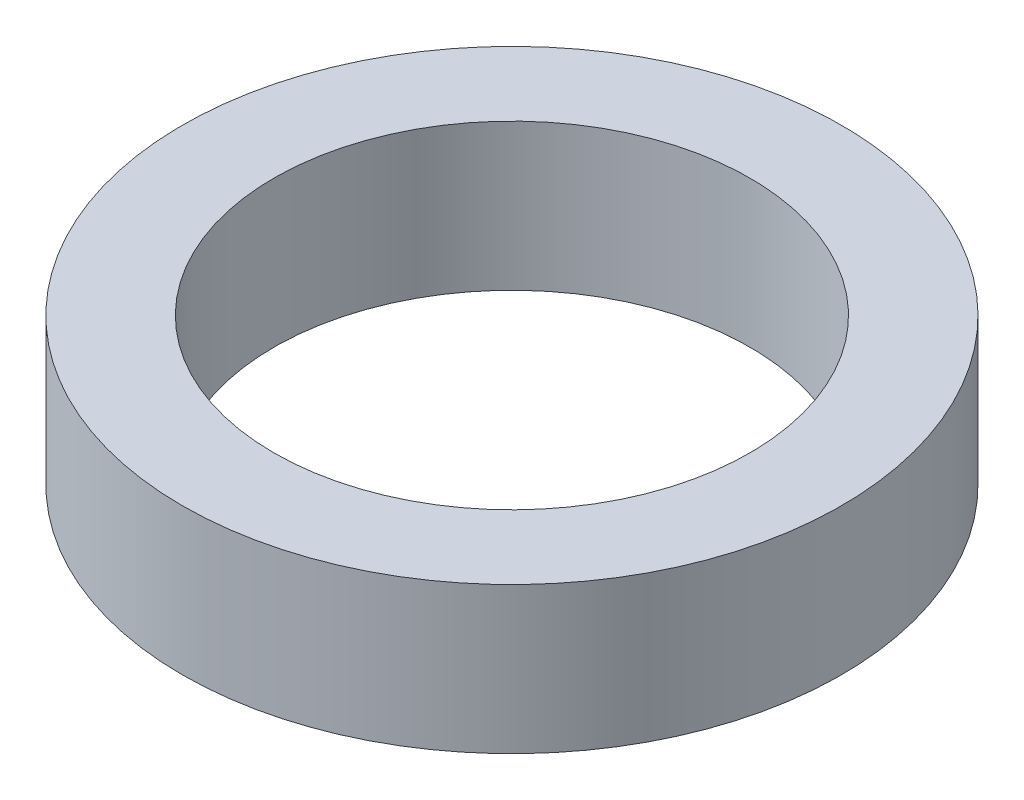
ISO-10303-21;
HEADER;
FILE_DESCRIPTION(('STEP AP214'),'2;1');
FILE_NAME('part.step','',(''),(''),'','','');
FILE_SCHEMA(('AUTOMOTIVE_DESIGN { 1 0 10303 214 1 1 1 1 }'));
ENDSEC;
DATA;
#1=APPLICATION_CONTEXT('core data for automotive mechanical design processes');
#2=APPLICATION_PROTOCOL_DEFINITION('international standard','automotive_design',2000,#1);
#3=PRODUCT_CONTEXT('',#1,'mechanical');
#4=PRODUCT('Part','Part','',(#3));
#5=PRODUCT_RELATED_PRODUCT_CATEGORY('part','',(#4));
#6=PRODUCT_DEFINITION_FORMATION('','',#4);
#7=PRODUCT_DEFINITION_CONTEXT('part definition',#1,'design');
#8=PRODUCT_DEFINITION('design','',#6,#7);
#9=PRODUCT_DEFINITION_SHAPE('','',#8);
#10=(LENGTH_UNIT() NAMED_UNIT(*) SI_UNIT(.MILLI.,.METRE.));
#11=(NAMED_UNIT(*) PLANE_ANGLE_UNIT() SI_UNIT($,.RADIAN.));
#12=(NAMED_UNIT(*) SI_UNIT($,.STERADIAN.) SOLID_ANGLE_UNIT());
#13=UNCERTAINTY_MEASURE_WITH_UNIT(LENGTH_MEASURE(1.E-05),#10,'distance_accuracy_value','');
#14=(GEOMETRIC_REPRESENTATION_CONTEXT(3) GLOBAL_UNCERTAINTY_ASSIGNED_CONTEXT((#13)) GLOBAL_UNIT_ASSIGNED_CONTEXT((#10,
#11,#12)) REPRESENTATION_CONTEXT('',''));
#15=CARTESIAN_POINT('',(0.,0.,0.));
#16=DIRECTION('',(0.,0.,1.));
#17=DIRECTION('',(1.,0.,0.));
#18=AXIS2_PLACEMENT_3D('',#15,#16,#17);
#19=CARTESIAN_POINT('',(0.,4.,0.));
#20=DIRECTION('',(0.,1.,0.));
#21=DIRECTION('',(0.,0.,1.));
#22=AXIS2_PLACEMENT_3D('',#19,#20,#21);
#23=PLANE('',#22);
#24=CARTESIAN_POINT('',(0.,4.,0.));
#25=DIRECTION('',(0.,1.,0.));
#26=DIRECTION('',(0.,0.,1.));
#27=AXIS2_PLACEMENT_3D('',#24,#25,#26);
#28=CIRCLE('',#27,9.);
#29=CARTESIAN_POINT('',(0.,4.,9.));
#30=VERTEX_POINT('',#29);
#31=EDGE_CURVE('E10',#30,#30,#28,.T.);
#32=ORIENTED_EDGE('',*,*,#31,.T.);
#33=EDGE_LOOP('',(#32));
#34=FACE_BOUND('',#33,.T.);
#35=CARTESIAN_POINT('',(0.,4.,0.));
#36=DIRECTION('',(0.,1.,0.));
#37=DIRECTION('',(0.,0.,1.));
#38=AXIS2_PLACEMENT_3D('',#35,#36,#37);
#39=CIRCLE('',#38,6.5);
#40=CARTESIAN_POINT('',(0.,4.,6.5));
#41=VERTEX_POINT('',#40);
#42=EDGE_CURVE('E42',#41,#41,#39,.T.);
#43=ORIENTED_EDGE('',*,*,#42,.F.);
#44=EDGE_LOOP('',(#43));
#45=FACE_BOUND('',#44,.T.);
#46=ADVANCED_FACE('F31',(#34,#45),#23,.T.);
#47=CARTESIAN_POINT('',(0.,0.,0.));
#48=DIRECTION('',(0.,1.,0.));
#49=DIRECTION('',(0.,0.,1.));
#50=AXIS2_PLACEMENT_3D('',#47,#48,#49);
#51=PLANE('',#50);
#52=CARTESIAN_POINT('',(0.,0.,0.));
#53=DIRECTION('',(0.,1.,0.));
#54=DIRECTION('',(0.,0.,1.));
#55=AXIS2_PLACEMENT_3D('',#52,#53,#54);
#56=CIRCLE('',#55,9.);
#57=CARTESIAN_POINT('',(0.,0.,9.));
#58=VERTEX_POINT('',#57);
#59=EDGE_CURVE('E35',#58,#58,#56,.T.);
#60=ORIENTED_EDGE('',*,*,#59,.F.);
#61=EDGE_LOOP('',(#60));
#62=FACE_BOUND('',#61,.T.);
#63=CARTESIAN_POINT('',(0.,0.,0.));
#64=DIRECTION('',(0.,1.,0.));
#65=DIRECTION('',(0.,0.,1.));
#66=AXIS2_PLACEMENT_3D('',#63,#64,#65);
#67=CIRCLE('',#66,6.5);
#68=CARTESIAN_POINT('',(0.,0.,6.5));
#69=VERTEX_POINT('',#68);
#70=EDGE_CURVE('E44',#69,#69,#67,.T.);
#71=ORIENTED_EDGE('',*,*,#70,.T.);
#72=EDGE_LOOP('',(#71));
#73=FACE_BOUND('',#72,.T.);
#74=ADVANCED_FACE('F54',(#62,#73),#51,.F.);
#75=CARTESIAN_POINT('',(0.,4.,0.));
#76=DIRECTION('',(0.,-1.,0.));
#77=DIRECTION('',(0.,0.,-1.));
#78=AXIS2_PLACEMENT_3D('',#75,#76,#77);
#79=CYLINDRICAL_SURFACE('',#78,9.);
#80=ORIENTED_EDGE('',*,*,#31,.F.);
#81=EDGE_LOOP('',(#80));
#82=FACE_BOUND('',#81,.T.);
#83=ORIENTED_EDGE('',*,*,#59,.T.);
#84=EDGE_LOOP('',(#83));
#85=FACE_BOUND('',#84,.T.);
#86=ADVANCED_FACE('F33',(#82,#85),#79,.T.);
#87=CARTESIAN_POINT('',(0.,4.,0.));
#88=DIRECTION('',(0.,-1.,0.));
#89=DIRECTION('',(0.,0.,-1.));
#90=AXIS2_PLACEMENT_3D('',#87,#88,#89);
#91=CYLINDRICAL_SURFACE('',#90,6.5);
#92=ORIENTED_EDGE('',*,*,#42,.T.);
#93=EDGE_LOOP('',(#92));
#94=FACE_BOUND('',#93,.T.);
#95=ORIENTED_EDGE('',*,*,#70,.F.);
#96=EDGE_LOOP('',(#95));
#97=FACE_BOUND('',#96,.T.);
#98=ADVANCED_FACE('F50',(#94,#97),#91,.F.);
#99=CLOSED_SHELL('',(#46,#74,#86,#98));
#100=MANIFOLD_SOLID_BREP('B2',#99);
#101=ADVANCED_BREP_SHAPE_REPRESENTATION('',(#18,#100),#14);
#102=SHAPE_DEFINITION_REPRESENTATION(#9,#101);
ENDSEC;
END-ISO-10303-21;
